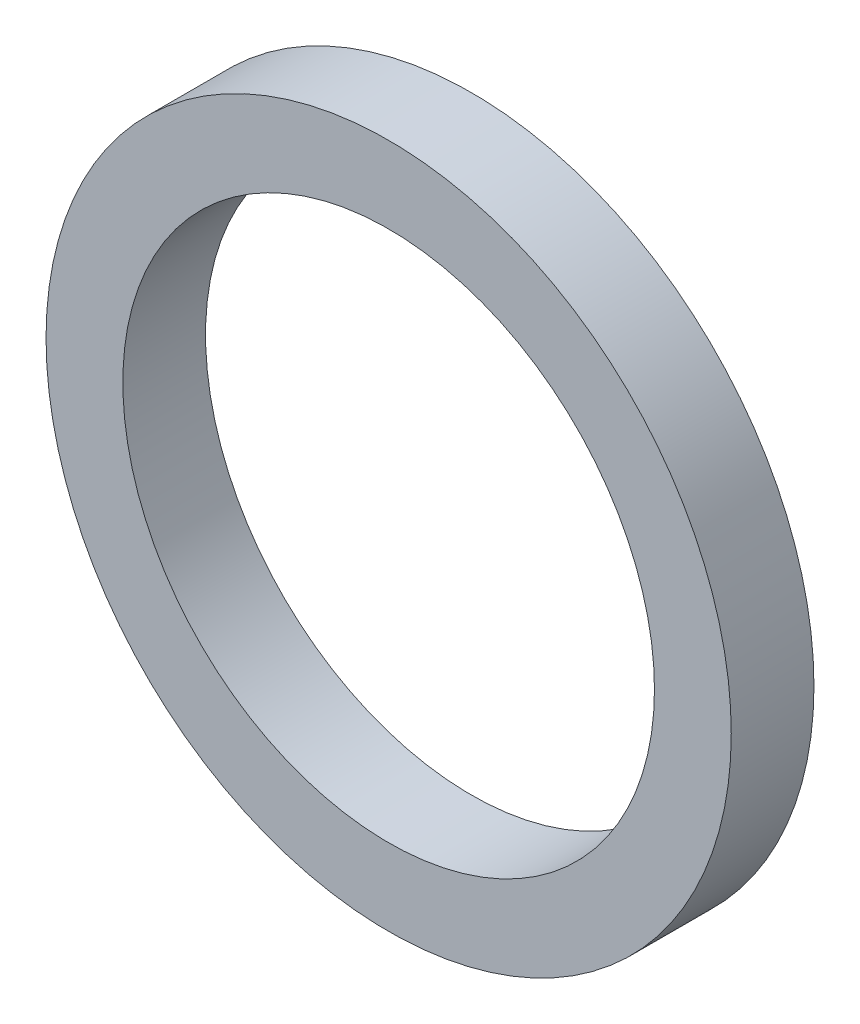
ISO-10303-21;
HEADER;
FILE_DESCRIPTION(('STEP AP214'),'2;1');
FILE_NAME('part.step','',(''),(''),'','','');
FILE_SCHEMA(('AUTOMOTIVE_DESIGN { 1 0 10303 214 1 1 1 1 }'));
ENDSEC;
DATA;
#1=APPLICATION_CONTEXT('core data for automotive mechanical design processes');
#2=APPLICATION_PROTOCOL_DEFINITION('international standard','automotive_design',2000,#1);
#3=PRODUCT_CONTEXT('',#1,'mechanical');
#4=PRODUCT('Part','Part','',(#3));
#5=PRODUCT_RELATED_PRODUCT_CATEGORY('part','',(#4));
#6=PRODUCT_DEFINITION_FORMATION('','',#4);
#7=PRODUCT_DEFINITION_CONTEXT('part definition',#1,'design');
#8=PRODUCT_DEFINITION('design','',#6,#7);
#9=PRODUCT_DEFINITION_SHAPE('','',#8);
#10=(LENGTH_UNIT() NAMED_UNIT(*) SI_UNIT(.MILLI.,.METRE.));
#11=(NAMED_UNIT(*) PLANE_ANGLE_UNIT() SI_UNIT($,.RADIAN.));
#12=(NAMED_UNIT(*) SI_UNIT($,.STERADIAN.) SOLID_ANGLE_UNIT());
#13=UNCERTAINTY_MEASURE_WITH_UNIT(LENGTH_MEASURE(1.E-05),#10,'distance_accuracy_value','');
#14=(GEOMETRIC_REPRESENTATION_CONTEXT(3) GLOBAL_UNCERTAINTY_ASSIGNED_CONTEXT((#13)) GLOBAL_UNIT_ASSIGNED_CONTEXT((#10,
#11,#12)) REPRESENTATION_CONTEXT('',''));
#15=CARTESIAN_POINT('',(0.,0.,0.));
#16=DIRECTION('',(0.,0.,1.));
#17=DIRECTION('',(1.,0.,0.));
#18=AXIS2_PLACEMENT_3D('',#15,#16,#17);
#19=CARTESIAN_POINT('',(0.,0.,7.));
#20=DIRECTION('',(0.,0.,1.));
#21=DIRECTION('',(1.,0.,0.));
#22=AXIS2_PLACEMENT_3D('',#19,#20,#21);
#23=PLANE('',#22);
#24=CARTESIAN_POINT('',(0.,0.,7.));
#25=DIRECTION('',(0.,0.,1.));
#26=DIRECTION('',(1.,0.,0.));
#27=AXIS2_PLACEMENT_3D('',#24,#25,#26);
#28=CIRCLE('',#27,29.);
#29=CARTESIAN_POINT('',(29.,0.,7.));
#30=VERTEX_POINT('',#29);
#31=EDGE_CURVE('E11',#30,#30,#28,.T.);
#32=ORIENTED_EDGE('',*,*,#31,.T.);
#33=EDGE_LOOP('',(#32));
#34=FACE_BOUND('',#33,.T.);
#35=CARTESIAN_POINT('',(0.,0.,7.));
#36=DIRECTION('',(0.,0.,1.));
#37=DIRECTION('',(1.,0.,0.));
#38=AXIS2_PLACEMENT_3D('',#35,#36,#37);
#39=CIRCLE('',#38,22.5);
#40=CARTESIAN_POINT('',(22.5,0.,7.));
#41=VERTEX_POINT('',#40);
#42=EDGE_CURVE('E56',#41,#41,#39,.T.);
#43=ORIENTED_EDGE('',*,*,#42,.F.);
#44=EDGE_LOOP('',(#43));
#45=FACE_BOUND('',#44,.T.);
#46=ADVANCED_FACE('F45',(#34,#45),#23,.T.);
#47=CARTESIAN_POINT('',(0.,0.,0.));
#48=DIRECTION('',(0.,0.,1.));
#49=DIRECTION('',(1.,0.,0.));
#50=AXIS2_PLACEMENT_3D('',#47,#48,#49);
#51=PLANE('',#50);
#52=CARTESIAN_POINT('',(0.,0.,0.));
#53=DIRECTION('',(0.,0.,1.));
#54=DIRECTION('',(1.,0.,0.));
#55=AXIS2_PLACEMENT_3D('',#52,#53,#54);
#56=CIRCLE('',#55,29.);
#57=CARTESIAN_POINT('',(29.,0.,0.));
#58=VERTEX_POINT('',#57);
#59=EDGE_CURVE('E49',#58,#58,#56,.T.);
#60=ORIENTED_EDGE('',*,*,#59,.F.);
#61=EDGE_LOOP('',(#60));
#62=FACE_BOUND('',#61,.T.);
#63=CARTESIAN_POINT('',(0.,0.,0.));
#64=DIRECTION('',(0.,0.,1.));
#65=DIRECTION('',(1.,0.,0.));
#66=AXIS2_PLACEMENT_3D('',#63,#64,#65);
#67=CIRCLE('',#66,22.5);
#68=CARTESIAN_POINT('',(22.5,0.,0.));
#69=VERTEX_POINT('',#68);
#70=EDGE_CURVE('E58',#69,#69,#67,.T.);
#71=ORIENTED_EDGE('',*,*,#70,.T.);
#72=EDGE_LOOP('',(#71));
#73=FACE_BOUND('',#72,.T.);
#74=ADVANCED_FACE('F68',(#62,#73),#51,.F.);
#75=CARTESIAN_POINT('',(0.,0.,7.));
#76=DIRECTION('',(0.,0.,-1.));
#77=DIRECTION('',(-1.,0.,0.));
#78=AXIS2_PLACEMENT_3D('',#75,#76,#77);
#79=CYLINDRICAL_SURFACE('',#78,29.);
#80=ORIENTED_EDGE('',*,*,#31,.F.);
#81=EDGE_LOOP('',(#80));
#82=FACE_BOUND('',#81,.T.);
#83=ORIENTED_EDGE('',*,*,#59,.T.);
#84=EDGE_LOOP('',(#83));
#85=FACE_BOUND('',#84,.T.);
#86=ADVANCED_FACE('F47',(#82,#85),#79,.T.);
#87=CARTESIAN_POINT('',(0.,0.,7.));
#88=DIRECTION('',(0.,0.,-1.));
#89=DIRECTION('',(-1.,0.,0.));
#90=AXIS2_PLACEMENT_3D('',#87,#88,#89);
#91=CYLINDRICAL_SURFACE('',#90,22.5);
#92=ORIENTED_EDGE('',*,*,#42,.T.);
#93=EDGE_LOOP('',(#92));
#94=FACE_BOUND('',#93,.T.);
#95=ORIENTED_EDGE('',*,*,#70,.F.);
#96=EDGE_LOOP('',(#95));
#97=FACE_BOUND('',#96,.T.);
#98=ADVANCED_FACE('F64',(#94,#97),#91,.F.);
#99=CLOSED_SHELL('',(#46,#74,#86,#98));
#100=MANIFOLD_SOLID_BREP('B2',#99);
#101=ADVANCED_BREP_SHAPE_REPRESENTATION('',(#18,#100),#14);
#102=SHAPE_DEFINITION_REPRESENTATION(#9,#101);
ENDSEC;
END-ISO-10303-21;
